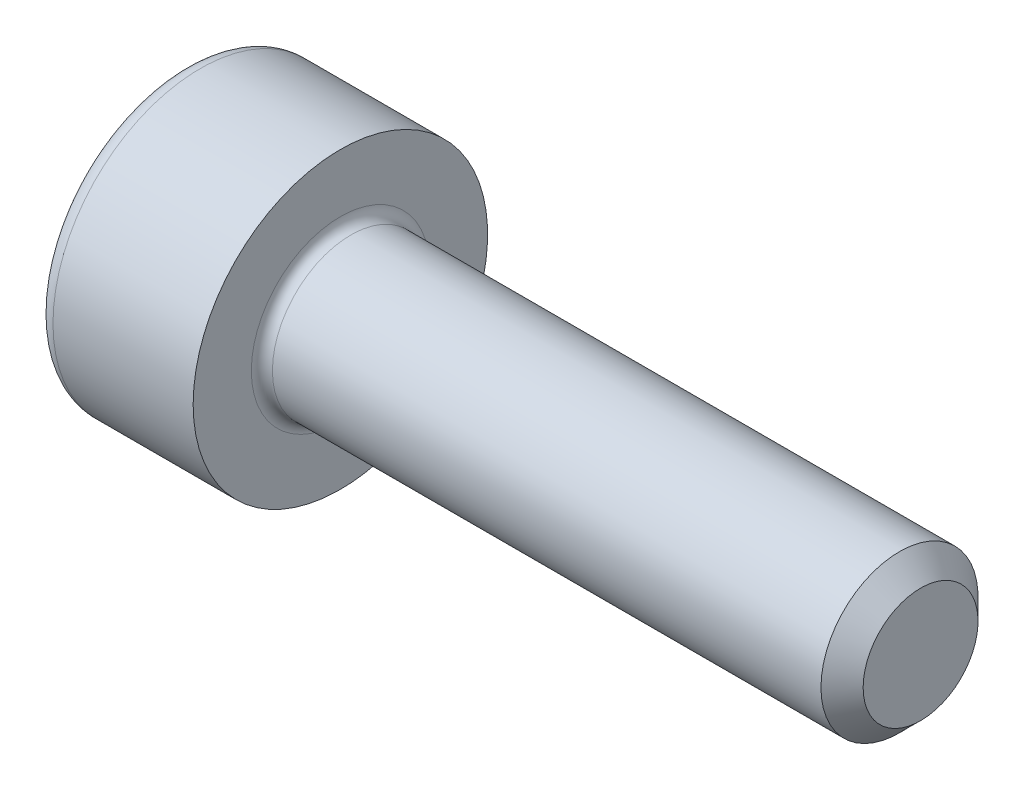
ISO-10303-21;
HEADER;
FILE_DESCRIPTION(('STEP AP214'),'2;1');
FILE_NAME('part.step','',(''),(''),'','','');
FILE_SCHEMA(('AUTOMOTIVE_DESIGN { 1 0 10303 214 1 1 1 1 }'));
ENDSEC;
DATA;
#1=APPLICATION_CONTEXT('core data for automotive mechanical design processes');
#2=APPLICATION_PROTOCOL_DEFINITION('international standard','automotive_design',2000,#1);
#3=PRODUCT_CONTEXT('',#1,'mechanical');
#4=PRODUCT('Part','Part','',(#3));
#5=PRODUCT_RELATED_PRODUCT_CATEGORY('part','',(#4));
#6=PRODUCT_DEFINITION_FORMATION('','',#4);
#7=PRODUCT_DEFINITION_CONTEXT('part definition',#1,'design');
#8=PRODUCT_DEFINITION('design','',#6,#7);
#9=PRODUCT_DEFINITION_SHAPE('','',#8);
#10=(LENGTH_UNIT() NAMED_UNIT(*) SI_UNIT(.MILLI.,.METRE.));
#11=(NAMED_UNIT(*) PLANE_ANGLE_UNIT() SI_UNIT($,.RADIAN.));
#12=(NAMED_UNIT(*) SI_UNIT($,.STERADIAN.) SOLID_ANGLE_UNIT());
#13=UNCERTAINTY_MEASURE_WITH_UNIT(LENGTH_MEASURE(1.E-05),#10,'distance_accuracy_value','');
#14=(GEOMETRIC_REPRESENTATION_CONTEXT(3) GLOBAL_UNCERTAINTY_ASSIGNED_CONTEXT((#13)) GLOBAL_UNIT_ASSIGNED_CONTEXT((#10,
#11,#12)) REPRESENTATION_CONTEXT('',''));
#15=CARTESIAN_POINT('',(0.,0.,0.));
#16=DIRECTION('',(0.,0.,1.));
#17=DIRECTION('',(1.,0.,0.));
#18=AXIS2_PLACEMENT_3D('',#15,#16,#17);
#19=CARTESIAN_POINT('',(0.,0.,0.));
#20=DIRECTION('',(-1.,0.,0.));
#21=DIRECTION('',(0.,0.,1.));
#22=AXIS2_PLACEMENT_3D('',#19,#20,#21);
#23=CYLINDRICAL_SURFACE('',#22,1.39568824458778);
#24=CARTESIAN_POINT('',(0.16,0.,0.));
#25=DIRECTION('',(1.,0.,0.));
#26=DIRECTION('',(0.,0.,-1.));
#27=AXIS2_PLACEMENT_3D('',#24,#25,#26);
#28=CIRCLE('',#27,1.39568824458778);
#29=CARTESIAN_POINT('',(0.16,0.,-1.39568824458778));
#30=VERTEX_POINT('',#29);
#31=EDGE_CURVE('E157',#30,#30,#28,.T.);
#32=ORIENTED_EDGE('',*,*,#31,.T.);
#33=EDGE_LOOP('',(#32));
#34=FACE_BOUND('',#33,.T.);
#35=CARTESIAN_POINT('',(1.48873412756029,0.,0.));
#36=DIRECTION('',(-1.,0.,0.));
#37=DIRECTION('',(0.,0.,1.));
#38=AXIS2_PLACEMENT_3D('',#35,#36,#37);
#39=CIRCLE('',#38,1.39568824458778);
#40=CARTESIAN_POINT('',(1.48873412756029,0.,1.39568824458778));
#41=VERTEX_POINT('',#40);
#42=EDGE_CURVE('E140',#41,#41,#39,.T.);
#43=ORIENTED_EDGE('',*,*,#42,.T.);
#44=EDGE_LOOP('',(#43));
#45=FACE_BOUND('',#44,.T.);
#46=ADVANCED_FACE('F38',(#34,#45),#23,.T.);
#47=CARTESIAN_POINT('',(0.,0.,0.));
#48=DIRECTION('',(1.,0.,0.));
#49=DIRECTION('',(0.,0.,-1.));
#50=AXIS2_PLACEMENT_3D('',#47,#48,#49);
#51=PLANE('',#50);
#52=DIRECTION('',(0.,-0.5,-0.866025403784439));
#53=VECTOR('',#52,1.);
#54=CARTESIAN_POINT('',(0.,0.877572409168232,0.));
#55=LINE('',#54,#53);
#56=CARTESIAN_POINT('',(0.,0.877572409168232,0.));
#57=VERTEX_POINT('',#56);
#58=CARTESIAN_POINT('',(0.,0.438786204584116,-0.760000000000001));
#59=VERTEX_POINT('',#58);
#60=EDGE_CURVE('E127',#57,#59,#55,.T.);
#61=ORIENTED_EDGE('',*,*,#60,.F.);
#62=DIRECTION('',(0.,0.5,-0.866025403784439));
#63=VECTOR('',#62,1.);
#64=CARTESIAN_POINT('',(0.,0.438786204584116,0.76));
#65=LINE('',#64,#63);
#66=CARTESIAN_POINT('',(0.,0.438786204584116,0.76));
#67=VERTEX_POINT('',#66);
#68=EDGE_CURVE('E53',#67,#57,#65,.T.);
#69=ORIENTED_EDGE('',*,*,#68,.F.);
#70=DIRECTION('',(0.,1.,0.));
#71=VECTOR('',#70,1.);
#72=CARTESIAN_POINT('',(0.,-0.438786204584116,0.76));
#73=LINE('',#72,#71);
#74=CARTESIAN_POINT('',(0.,-0.438786204584116,0.76));
#75=VERTEX_POINT('',#74);
#76=EDGE_CURVE('E136',#75,#67,#73,.T.);
#77=ORIENTED_EDGE('',*,*,#76,.F.);
#78=DIRECTION('',(0.,0.5,0.866025403784439));
#79=VECTOR('',#78,1.);
#80=CARTESIAN_POINT('',(0.,-0.877572409168232,0.));
#81=LINE('',#80,#79);
#82=CARTESIAN_POINT('',(0.,-0.877572409168232,0.));
#83=VERTEX_POINT('',#82);
#84=EDGE_CURVE('E134',#83,#75,#81,.T.);
#85=ORIENTED_EDGE('',*,*,#84,.F.);
#86=DIRECTION('',(0.,-0.5,0.866025403784438));
#87=VECTOR('',#86,1.);
#88=CARTESIAN_POINT('',(0.,-0.438786204584116,-0.760000000000001));
#89=LINE('',#88,#87);
#90=CARTESIAN_POINT('',(0.,-0.438786204584116,-0.760000000000001));
#91=VERTEX_POINT('',#90);
#92=EDGE_CURVE('E101',#91,#83,#89,.T.);
#93=ORIENTED_EDGE('',*,*,#92,.F.);
#94=DIRECTION('',(0.,-1.,0.));
#95=VECTOR('',#94,1.);
#96=CARTESIAN_POINT('',(0.,0.438786204584116,-0.760000000000001));
#97=LINE('',#96,#95);
#98=EDGE_CURVE('E130',#59,#91,#97,.T.);
#99=ORIENTED_EDGE('',*,*,#98,.F.);
#100=EDGE_LOOP('',(#61,#69,#77,#85,#93,#99));
#101=FACE_BOUND('',#100,.T.);
#102=CARTESIAN_POINT('',(0.,0.,0.));
#103=DIRECTION('',(1.,0.,0.));
#104=DIRECTION('',(0.,0.,-1.));
#105=AXIS2_PLACEMENT_3D('',#102,#103,#104);
#106=CIRCLE('',#105,1.23568824458778);
#107=CARTESIAN_POINT('',(0.,0.,-1.23568824458778));
#108=VERTEX_POINT('',#107);
#109=EDGE_CURVE('E154',#108,#108,#106,.F.);
#110=ORIENTED_EDGE('',*,*,#109,.T.);
#111=EDGE_LOOP('',(#110));
#112=FACE_BOUND('',#111,.T.);
#113=ADVANCED_FACE('F179',(#101,#112),#51,.F.);
#114=CARTESIAN_POINT('',(6.98873412756029,0.,0.));
#115=DIRECTION('',(-1.,0.,0.));
#116=DIRECTION('',(0.,0.,1.));
#117=AXIS2_PLACEMENT_3D('',#114,#115,#116);
#118=PLANE('',#117);
#119=CARTESIAN_POINT('',(6.98873412756029,0.,0.));
#120=DIRECTION('',(-1.,0.,0.));
#121=DIRECTION('',(0.,0.,1.));
#122=AXIS2_PLACEMENT_3D('',#119,#120,#121);
#123=CIRCLE('',#122,0.544367063780147);
#124=CARTESIAN_POINT('',(6.98873412756029,0.,0.544367063780147));
#125=VERTEX_POINT('',#124);
#126=EDGE_CURVE('E11',#125,#125,#123,.F.);
#127=ORIENTED_EDGE('',*,*,#126,.T.);
#128=EDGE_LOOP('',(#127));
#129=FACE_BOUND('',#128,.T.);
#130=ADVANCED_FACE('F185',(#129),#118,.F.);
#131=CARTESIAN_POINT('',(0.,0.,0.));
#132=DIRECTION('',(-1.,0.,0.));
#133=DIRECTION('',(0.,0.,1.));
#134=AXIS2_PLACEMENT_3D('',#131,#132,#133);
#135=CYLINDRICAL_SURFACE('',#134,0.744367063780146);
#136=CARTESIAN_POINT('',(6.7887341275603,0.,0.));
#137=DIRECTION('',(-1.,0.,0.));
#138=DIRECTION('',(0.,0.,1.));
#139=AXIS2_PLACEMENT_3D('',#136,#137,#138);
#140=CIRCLE('',#139,0.744367063780146);
#141=CARTESIAN_POINT('',(6.7887341275603,0.,0.744367063780146));
#142=VERTEX_POINT('',#141);
#143=EDGE_CURVE('E46',#142,#142,#140,.T.);
#144=ORIENTED_EDGE('',*,*,#143,.T.);
#145=EDGE_LOOP('',(#144));
#146=FACE_BOUND('',#145,.T.);
#147=CARTESIAN_POINT('',(1.58873412756029,0.,0.));
#148=DIRECTION('',(-1.,0.,0.));
#149=DIRECTION('',(0.,0.,1.));
#150=AXIS2_PLACEMENT_3D('',#147,#148,#149);
#151=CIRCLE('',#150,0.744367063780146);
#152=CARTESIAN_POINT('',(1.58873412756029,0.,0.744367063780146));
#153=VERTEX_POINT('',#152);
#154=EDGE_CURVE('E151',#153,#153,#151,.F.);
#155=ORIENTED_EDGE('',*,*,#154,.T.);
#156=EDGE_LOOP('',(#155));
#157=FACE_BOUND('',#156,.T.);
#158=ADVANCED_FACE('F162',(#146,#157),#135,.T.);
#159=CARTESIAN_POINT('',(1.48873412756029,0.,0.));
#160=DIRECTION('',(-1.,0.,0.));
#161=DIRECTION('',(0.,0.,1.));
#162=AXIS2_PLACEMENT_3D('',#159,#160,#161);
#163=PLANE('',#162);
#164=CARTESIAN_POINT('',(1.48873412756029,0.,0.));
#165=DIRECTION('',(-1.,0.,0.));
#166=DIRECTION('',(0.,0.,1.));
#167=AXIS2_PLACEMENT_3D('',#164,#165,#166);
#168=CIRCLE('',#167,0.844367063780146);
#169=CARTESIAN_POINT('',(1.48873412756029,0.,0.844367063780146));
#170=VERTEX_POINT('',#169);
#171=EDGE_CURVE('E148',#170,#170,#168,.T.);
#172=ORIENTED_EDGE('',*,*,#171,.T.);
#173=EDGE_LOOP('',(#172));
#174=FACE_BOUND('',#173,.T.);
#175=ORIENTED_EDGE('',*,*,#42,.F.);
#176=EDGE_LOOP('',(#175));
#177=FACE_BOUND('',#176,.T.);
#178=ADVANCED_FACE('F192',(#174,#177),#163,.F.);
#179=CARTESIAN_POINT('',(1.58873412756029,0.,0.));
#180=DIRECTION('',(-1.,0.,0.));
#181=DIRECTION('',(0.,0.,1.));
#182=AXIS2_PLACEMENT_3D('',#179,#180,#181);
#183=TOROIDAL_SURFACE('',#182,0.844367063780146,0.1);
#184=ORIENTED_EDGE('',*,*,#154,.F.);
#185=EDGE_LOOP('',(#184));
#186=FACE_BOUND('',#185,.T.);
#187=ORIENTED_EDGE('',*,*,#171,.F.);
#188=EDGE_LOOP('',(#187));
#189=FACE_BOUND('',#188,.T.);
#190=ADVANCED_FACE('F175',(#186,#189),#183,.F.);
#191=CARTESIAN_POINT('',(0.16,0.,0.));
#192=DIRECTION('',(1.,0.,0.));
#193=DIRECTION('',(0.,0.,-1.));
#194=AXIS2_PLACEMENT_3D('',#191,#192,#193);
#195=TOROIDAL_SURFACE('',#194,1.23568824458778,0.16);
#196=ORIENTED_EDGE('',*,*,#31,.F.);
#197=EDGE_LOOP('',(#196));
#198=FACE_BOUND('',#197,.T.);
#199=ORIENTED_EDGE('',*,*,#109,.F.);
#200=EDGE_LOOP('',(#199));
#201=FACE_BOUND('',#200,.T.);
#202=ADVANCED_FACE('F167',(#198,#201),#195,.T.);
#203=CARTESIAN_POINT('',(6.7887341275603,0.,0.));
#204=DIRECTION('',(-1.,0.,0.));
#205=DIRECTION('',(0.,0.,1.));
#206=AXIS2_PLACEMENT_3D('',#203,#204,#205);
#207=CONICAL_SURFACE('',#206,0.744367063780146,0.785398163397451);
#208=ORIENTED_EDGE('',*,*,#126,.F.);
#209=EDGE_LOOP('',(#208));
#210=FACE_BOUND('',#209,.T.);
#211=ORIENTED_EDGE('',*,*,#143,.F.);
#212=EDGE_LOOP('',(#211));
#213=FACE_BOUND('',#212,.T.);
#214=ADVANCED_FACE('F40',(#210,#213),#207,.T.);
#215=CARTESIAN_POINT('',(0.7,0.438786204584116,0.76));
#216=DIRECTION('',(0.,0.866025403784439,0.5));
#217=DIRECTION('',(0.,-0.5,0.866025403784439));
#218=AXIS2_PLACEMENT_3D('',#215,#216,#217);
#219=PLANE('',#218);
#220=ORIENTED_EDGE('',*,*,#68,.T.);
#221=DIRECTION('',(-1.,0.,0.));
#222=VECTOR('',#221,1.);
#223=CARTESIAN_POINT('',(0.7,0.877572409168232,0.));
#224=LINE('',#223,#222);
#225=CARTESIAN_POINT('',(0.7,0.877572409168232,0.));
#226=VERTEX_POINT('',#225);
#227=EDGE_CURVE('E83',#226,#57,#224,.T.);
#228=ORIENTED_EDGE('',*,*,#227,.F.);
#229=DIRECTION('',(0.,0.5,-0.866025403784439));
#230=VECTOR('',#229,1.);
#231=CARTESIAN_POINT('',(0.7,0.438786204584116,0.76));
#232=LINE('',#231,#230);
#233=CARTESIAN_POINT('',(0.7,0.438786204584116,0.76));
#234=VERTEX_POINT('',#233);
#235=EDGE_CURVE('E138',#234,#226,#232,.T.);
#236=ORIENTED_EDGE('',*,*,#235,.F.);
#237=DIRECTION('',(-1.,0.,0.));
#238=VECTOR('',#237,1.);
#239=CARTESIAN_POINT('',(0.7,0.438786204584116,0.76));
#240=LINE('',#239,#238);
#241=EDGE_CURVE('E61',#234,#67,#240,.T.);
#242=ORIENTED_EDGE('',*,*,#241,.T.);
#243=EDGE_LOOP('',(#220,#228,#236,#242));
#244=FACE_BOUND('',#243,.T.);
#245=ADVANCED_FACE('F166',(#244),#219,.F.);
#246=CARTESIAN_POINT('',(0.7,-0.438786204584116,0.76));
#247=DIRECTION('',(0.,0.,1.));
#248=DIRECTION('',(1.,0.,0.));
#249=AXIS2_PLACEMENT_3D('',#246,#247,#248);
#250=PLANE('',#249);
#251=ORIENTED_EDGE('',*,*,#76,.T.);
#252=ORIENTED_EDGE('',*,*,#241,.F.);
#253=DIRECTION('',(0.,1.,0.));
#254=VECTOR('',#253,1.);
#255=CARTESIAN_POINT('',(0.7,-0.438786204584116,0.76));
#256=LINE('',#255,#254);
#257=CARTESIAN_POINT('',(0.7,-0.438786204584116,0.76));
#258=VERTEX_POINT('',#257);
#259=EDGE_CURVE('E113',#258,#234,#256,.T.);
#260=ORIENTED_EDGE('',*,*,#259,.F.);
#261=DIRECTION('',(-1.,0.,0.));
#262=VECTOR('',#261,1.);
#263=CARTESIAN_POINT('',(0.7,-0.438786204584116,0.76));
#264=LINE('',#263,#262);
#265=EDGE_CURVE('E105',#258,#75,#264,.T.);
#266=ORIENTED_EDGE('',*,*,#265,.T.);
#267=EDGE_LOOP('',(#251,#252,#260,#266));
#268=FACE_BOUND('',#267,.T.);
#269=ADVANCED_FACE('F173',(#268),#250,.F.);
#270=CARTESIAN_POINT('',(0.7,-0.877572409168232,0.));
#271=DIRECTION('',(0.,-0.866025403784439,0.5));
#272=DIRECTION('',(0.,-0.5,-0.866025403784439));
#273=AXIS2_PLACEMENT_3D('',#270,#271,#272);
#274=PLANE('',#273);
#275=ORIENTED_EDGE('',*,*,#84,.T.);
#276=ORIENTED_EDGE('',*,*,#265,.F.);
#277=DIRECTION('',(0.,0.5,0.866025403784439));
#278=VECTOR('',#277,1.);
#279=CARTESIAN_POINT('',(0.7,-0.877572409168232,0.));
#280=LINE('',#279,#278);
#281=CARTESIAN_POINT('',(0.7,-0.877572409168232,0.));
#282=VERTEX_POINT('',#281);
#283=EDGE_CURVE('E109',#282,#258,#280,.T.);
#284=ORIENTED_EDGE('',*,*,#283,.F.);
#285=DIRECTION('',(-1.,0.,0.));
#286=VECTOR('',#285,1.);
#287=CARTESIAN_POINT('',(0.7,-0.877572409168232,0.));
#288=LINE('',#287,#286);
#289=EDGE_CURVE('E94',#282,#83,#288,.T.);
#290=ORIENTED_EDGE('',*,*,#289,.T.);
#291=EDGE_LOOP('',(#275,#276,#284,#290));
#292=FACE_BOUND('',#291,.T.);
#293=ADVANCED_FACE('F110',(#292),#274,.F.);
#294=CARTESIAN_POINT('',(0.7,-0.438786204584116,-0.760000000000001));
#295=DIRECTION('',(0.,-0.866025403784438,-0.5));
#296=DIRECTION('',(0.,0.5,-0.866025403784438));
#297=AXIS2_PLACEMENT_3D('',#294,#295,#296);
#298=PLANE('',#297);
#299=ORIENTED_EDGE('',*,*,#92,.T.);
#300=ORIENTED_EDGE('',*,*,#289,.F.);
#301=DIRECTION('',(0.,-0.5,0.866025403784438));
#302=VECTOR('',#301,1.);
#303=CARTESIAN_POINT('',(0.7,-0.438786204584116,-0.760000000000001));
#304=LINE('',#303,#302);
#305=CARTESIAN_POINT('',(0.7,-0.438786204584116,-0.760000000000001));
#306=VERTEX_POINT('',#305);
#307=EDGE_CURVE('E98',#306,#282,#304,.T.);
#308=ORIENTED_EDGE('',*,*,#307,.F.);
#309=DIRECTION('',(-1.,0.,0.));
#310=VECTOR('',#309,1.);
#311=CARTESIAN_POINT('',(0.7,-0.438786204584116,-0.760000000000001));
#312=LINE('',#311,#310);
#313=EDGE_CURVE('E106',#306,#91,#312,.T.);
#314=ORIENTED_EDGE('',*,*,#313,.T.);
#315=EDGE_LOOP('',(#299,#300,#308,#314));
#316=FACE_BOUND('',#315,.T.);
#317=ADVANCED_FACE('F96',(#316),#298,.F.);
#318=CARTESIAN_POINT('',(0.7,0.438786204584116,-0.760000000000001));
#319=DIRECTION('',(0.,0.,-1.));
#320=DIRECTION('',(0.,1.,0.));
#321=AXIS2_PLACEMENT_3D('',#318,#319,#320);
#322=PLANE('',#321);
#323=ORIENTED_EDGE('',*,*,#98,.T.);
#324=ORIENTED_EDGE('',*,*,#313,.F.);
#325=DIRECTION('',(0.,-1.,0.));
#326=VECTOR('',#325,1.);
#327=CARTESIAN_POINT('',(0.7,0.438786204584116,-0.760000000000001));
#328=LINE('',#327,#326);
#329=CARTESIAN_POINT('',(0.7,0.438786204584116,-0.760000000000001));
#330=VERTEX_POINT('',#329);
#331=EDGE_CURVE('E119',#330,#306,#328,.T.);
#332=ORIENTED_EDGE('',*,*,#331,.F.);
#333=DIRECTION('',(-1.,0.,0.));
#334=VECTOR('',#333,1.);
#335=CARTESIAN_POINT('',(0.7,0.438786204584116,-0.760000000000001));
#336=LINE('',#335,#334);
#337=EDGE_CURVE('E143',#330,#59,#336,.T.);
#338=ORIENTED_EDGE('',*,*,#337,.T.);
#339=EDGE_LOOP('',(#323,#324,#332,#338));
#340=FACE_BOUND('',#339,.T.);
#341=ADVANCED_FACE('F214',(#340),#322,.F.);
#342=CARTESIAN_POINT('',(0.7,0.877572409168232,0.));
#343=DIRECTION('',(0.,0.866025403784439,-0.5));
#344=DIRECTION('',(0.,0.5,0.866025403784439));
#345=AXIS2_PLACEMENT_3D('',#342,#343,#344);
#346=PLANE('',#345);
#347=ORIENTED_EDGE('',*,*,#60,.T.);
#348=ORIENTED_EDGE('',*,*,#337,.F.);
#349=DIRECTION('',(0.,-0.5,-0.866025403784439));
#350=VECTOR('',#349,1.);
#351=CARTESIAN_POINT('',(0.7,0.877572409168232,0.));
#352=LINE('',#351,#350);
#353=EDGE_CURVE('E121',#226,#330,#352,.T.);
#354=ORIENTED_EDGE('',*,*,#353,.F.);
#355=ORIENTED_EDGE('',*,*,#227,.T.);
#356=EDGE_LOOP('',(#347,#348,#354,#355));
#357=FACE_BOUND('',#356,.T.);
#358=ADVANCED_FACE('F211',(#357),#346,.F.);
#359=CARTESIAN_POINT('',(0.7,0.,0.));
#360=DIRECTION('',(-1.,0.,0.));
#361=DIRECTION('',(0.,0.,1.));
#362=AXIS2_PLACEMENT_3D('',#359,#360,#361);
#363=PLANE('',#362);
#364=ORIENTED_EDGE('',*,*,#235,.T.);
#365=ORIENTED_EDGE('',*,*,#353,.T.);
#366=ORIENTED_EDGE('',*,*,#331,.T.);
#367=ORIENTED_EDGE('',*,*,#307,.T.);
#368=ORIENTED_EDGE('',*,*,#283,.T.);
#369=ORIENTED_EDGE('',*,*,#259,.T.);
#370=EDGE_LOOP('',(#364,#365,#366,#367,#368,#369));
#371=FACE_BOUND('',#370,.T.);
#372=ADVANCED_FACE('F116',(#371),#363,.T.);
#373=CLOSED_SHELL('',(#46,#113,#130,#158,#178,#190,#202,#214,#245,#269,#293,#317,#341,#358,#372));
#374=MANIFOLD_SOLID_BREP('B2',#373);
#375=ADVANCED_BREP_SHAPE_REPRESENTATION('',(#18,#374),#14);
#376=SHAPE_DEFINITION_REPRESENTATION(#9,#375);
ENDSEC;
END-ISO-10303-21;
